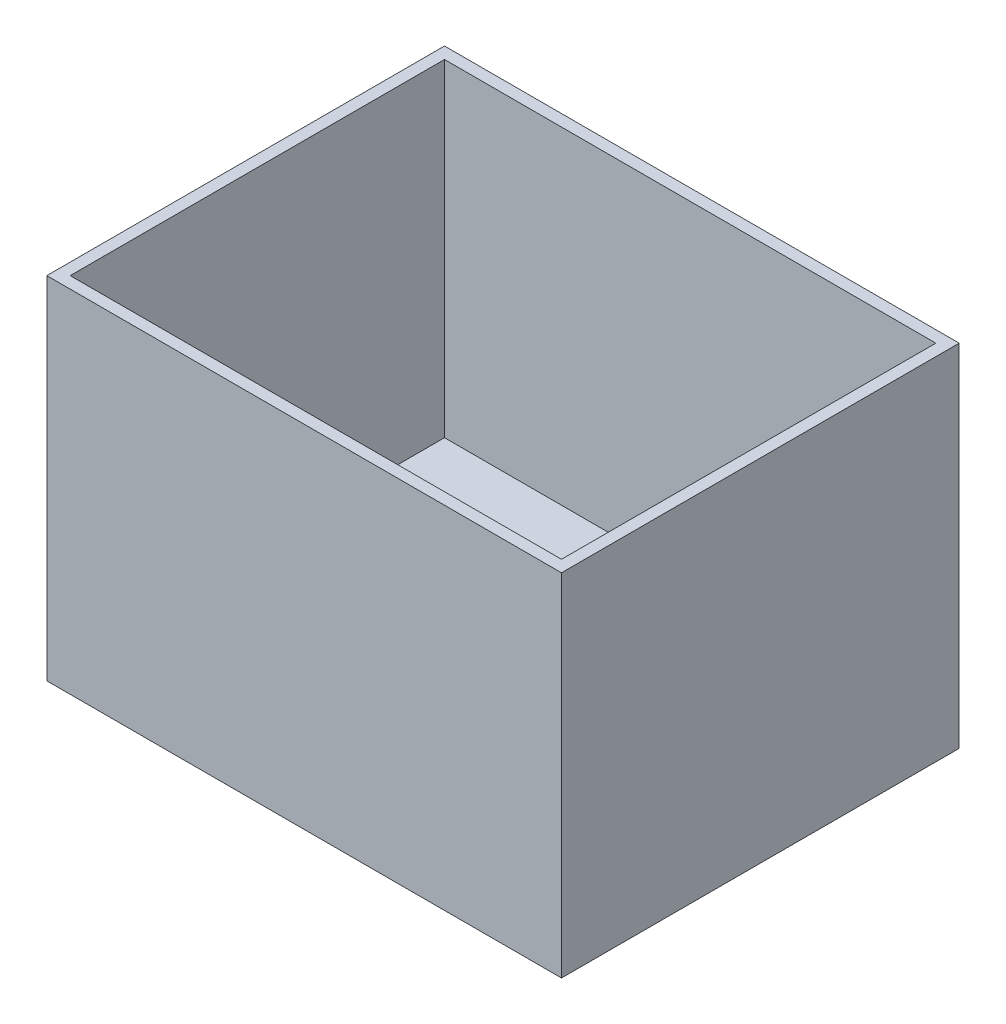
ISO-10303-21;
HEADER;
FILE_DESCRIPTION(('STEP AP214'),'2;1');
FILE_NAME('part.step','',(''),(''),'','','');
FILE_SCHEMA(('AUTOMOTIVE_DESIGN { 1 0 10303 214 1 1 1 1 }'));
ENDSEC;
DATA;
#1=APPLICATION_CONTEXT('core data for automotive mechanical design processes');
#2=APPLICATION_PROTOCOL_DEFINITION('international standard','automotive_design',2000,#1);
#3=PRODUCT_CONTEXT('',#1,'mechanical');
#4=PRODUCT('Part','Part','',(#3));
#5=PRODUCT_RELATED_PRODUCT_CATEGORY('part','',(#4));
#6=PRODUCT_DEFINITION_FORMATION('','',#4);
#7=PRODUCT_DEFINITION_CONTEXT('part definition',#1,'design');
#8=PRODUCT_DEFINITION('design','',#6,#7);
#9=PRODUCT_DEFINITION_SHAPE('','',#8);
#10=(LENGTH_UNIT() NAMED_UNIT(*) SI_UNIT(.MILLI.,.METRE.));
#11=(NAMED_UNIT(*) PLANE_ANGLE_UNIT() SI_UNIT($,.RADIAN.));
#12=(NAMED_UNIT(*) SI_UNIT($,.STERADIAN.) SOLID_ANGLE_UNIT());
#13=UNCERTAINTY_MEASURE_WITH_UNIT(LENGTH_MEASURE(1.E-05),#10,'distance_accuracy_value','');
#14=(GEOMETRIC_REPRESENTATION_CONTEXT(3) GLOBAL_UNCERTAINTY_ASSIGNED_CONTEXT((#13)) GLOBAL_UNIT_ASSIGNED_CONTEXT((#10,
#11,#12)) REPRESENTATION_CONTEXT('',''));
#15=CARTESIAN_POINT('',(0.,0.,0.));
#16=DIRECTION('',(0.,0.,1.));
#17=DIRECTION('',(1.,0.,0.));
#18=AXIS2_PLACEMENT_3D('',#15,#16,#17);
#19=CARTESIAN_POINT('',(220.,300.,170.));
#20=DIRECTION('',(-1.,0.,0.));
#21=DIRECTION('',(0.,0.,1.));
#22=AXIS2_PLACEMENT_3D('',#19,#20,#21);
#23=PLANE('',#22);
#24=DIRECTION('',(0.,0.,-1.));
#25=VECTOR('',#24,1.);
#26=CARTESIAN_POINT('',(220.,0.,170.));
#27=LINE('',#26,#25);
#28=CARTESIAN_POINT('',(220.,0.,170.));
#29=VERTEX_POINT('',#28);
#30=CARTESIAN_POINT('',(220.,0.,-170.));
#31=VERTEX_POINT('',#30);
#32=EDGE_CURVE('E164',#29,#31,#27,.T.);
#33=ORIENTED_EDGE('',*,*,#32,.T.);
#34=DIRECTION('',(0.,-1.,0.));
#35=VECTOR('',#34,1.);
#36=CARTESIAN_POINT('',(220.,300.,-170.));
#37=LINE('',#36,#35);
#38=CARTESIAN_POINT('',(220.,300.,-170.));
#39=VERTEX_POINT('',#38);
#40=EDGE_CURVE('E11',#39,#31,#37,.T.);
#41=ORIENTED_EDGE('',*,*,#40,.F.);
#42=DIRECTION('',(0.,0.,-1.));
#43=VECTOR('',#42,1.);
#44=CARTESIAN_POINT('',(220.,300.,170.));
#45=LINE('',#44,#43);
#46=CARTESIAN_POINT('',(220.,300.,170.));
#47=VERTEX_POINT('',#46);
#48=EDGE_CURVE('E170',#47,#39,#45,.T.);
#49=ORIENTED_EDGE('',*,*,#48,.F.);
#50=DIRECTION('',(0.,-1.,0.));
#51=VECTOR('',#50,1.);
#52=CARTESIAN_POINT('',(220.,300.,170.));
#53=LINE('',#52,#51);
#54=EDGE_CURVE('E180',#47,#29,#53,.T.);
#55=ORIENTED_EDGE('',*,*,#54,.T.);
#56=EDGE_LOOP('',(#33,#41,#49,#55));
#57=FACE_BOUND('',#56,.T.);
#58=ADVANCED_FACE('F45',(#57),#23,.F.);
#59=CARTESIAN_POINT('',(-220.,300.,-170.));
#60=DIRECTION('',(0.,0.,1.));
#61=DIRECTION('',(1.,0.,0.));
#62=AXIS2_PLACEMENT_3D('',#59,#60,#61);
#63=PLANE('',#62);
#64=DIRECTION('',(-1.,0.,0.));
#65=VECTOR('',#64,1.);
#66=CARTESIAN_POINT('',(-220.,0.,-170.));
#67=LINE('',#66,#65);
#68=CARTESIAN_POINT('',(-220.,0.,-170.));
#69=VERTEX_POINT('',#68);
#70=EDGE_CURVE('E184',#31,#69,#67,.T.);
#71=ORIENTED_EDGE('',*,*,#70,.T.);
#72=DIRECTION('',(0.,-1.,0.));
#73=VECTOR('',#72,1.);
#74=CARTESIAN_POINT('',(-220.,300.,-170.));
#75=LINE('',#74,#73);
#76=CARTESIAN_POINT('',(-220.,300.,-170.));
#77=VERTEX_POINT('',#76);
#78=EDGE_CURVE('E53',#77,#69,#75,.T.);
#79=ORIENTED_EDGE('',*,*,#78,.F.);
#80=DIRECTION('',(-1.,0.,0.));
#81=VECTOR('',#80,1.);
#82=CARTESIAN_POINT('',(-220.,300.,-170.));
#83=LINE('',#82,#81);
#84=EDGE_CURVE('E97',#39,#77,#83,.T.);
#85=ORIENTED_EDGE('',*,*,#84,.F.);
#86=ORIENTED_EDGE('',*,*,#40,.T.);
#87=EDGE_LOOP('',(#71,#79,#85,#86));
#88=FACE_BOUND('',#87,.T.);
#89=ADVANCED_FACE('F220',(#88),#63,.F.);
#90=CARTESIAN_POINT('',(-220.,300.,170.));
#91=DIRECTION('',(1.,0.,0.));
#92=DIRECTION('',(0.,0.,-1.));
#93=AXIS2_PLACEMENT_3D('',#90,#91,#92);
#94=PLANE('',#93);
#95=DIRECTION('',(0.,0.,1.));
#96=VECTOR('',#95,1.);
#97=CARTESIAN_POINT('',(-220.,0.,170.));
#98=LINE('',#97,#96);
#99=CARTESIAN_POINT('',(-220.,0.,170.));
#100=VERTEX_POINT('',#99);
#101=EDGE_CURVE('E187',#69,#100,#98,.T.);
#102=ORIENTED_EDGE('',*,*,#101,.T.);
#103=DIRECTION('',(0.,-1.,0.));
#104=VECTOR('',#103,1.);
#105=CARTESIAN_POINT('',(-220.,300.,170.));
#106=LINE('',#105,#104);
#107=CARTESIAN_POINT('',(-220.,300.,170.));
#108=VERTEX_POINT('',#107);
#109=EDGE_CURVE('E194',#108,#100,#106,.T.);
#110=ORIENTED_EDGE('',*,*,#109,.F.);
#111=DIRECTION('',(0.,0.,1.));
#112=VECTOR('',#111,1.);
#113=CARTESIAN_POINT('',(-220.,300.,170.));
#114=LINE('',#113,#112);
#115=EDGE_CURVE('E175',#77,#108,#114,.T.);
#116=ORIENTED_EDGE('',*,*,#115,.F.);
#117=ORIENTED_EDGE('',*,*,#78,.T.);
#118=EDGE_LOOP('',(#102,#110,#116,#117));
#119=FACE_BOUND('',#118,.T.);
#120=ADVANCED_FACE('F201',(#119),#94,.F.);
#121=CARTESIAN_POINT('',(-220.,300.,170.));
#122=DIRECTION('',(0.,0.,-1.));
#123=DIRECTION('',(-1.,0.,0.));
#124=AXIS2_PLACEMENT_3D('',#121,#122,#123);
#125=PLANE('',#124);
#126=DIRECTION('',(1.,0.,0.));
#127=VECTOR('',#126,1.);
#128=CARTESIAN_POINT('',(-220.,0.,170.));
#129=LINE('',#128,#127);
#130=EDGE_CURVE('E90',#100,#29,#129,.T.);
#131=ORIENTED_EDGE('',*,*,#130,.T.);
#132=ORIENTED_EDGE('',*,*,#54,.F.);
#133=DIRECTION('',(1.,0.,0.));
#134=VECTOR('',#133,1.);
#135=CARTESIAN_POINT('',(-220.,300.,170.));
#136=LINE('',#135,#134);
#137=EDGE_CURVE('E69',#108,#47,#136,.T.);
#138=ORIENTED_EDGE('',*,*,#137,.F.);
#139=ORIENTED_EDGE('',*,*,#109,.T.);
#140=EDGE_LOOP('',(#131,#132,#138,#139));
#141=FACE_BOUND('',#140,.T.);
#142=ADVANCED_FACE('F209',(#141),#125,.F.);
#143=CARTESIAN_POINT('',(0.,300.,0.));
#144=DIRECTION('',(0.,-1.,0.));
#145=DIRECTION('',(0.,0.,-1.));
#146=AXIS2_PLACEMENT_3D('',#143,#144,#145);
#147=PLANE('',#146);
#148=DIRECTION('',(-1.,0.,0.));
#149=VECTOR('',#148,1.);
#150=CARTESIAN_POINT('',(-210.,300.,-160.));
#151=LINE('',#150,#149);
#152=CARTESIAN_POINT('',(210.,300.,-160.));
#153=VERTEX_POINT('',#152);
#154=CARTESIAN_POINT('',(-210.,300.,-160.));
#155=VERTEX_POINT('',#154);
#156=EDGE_CURVE('E155',#153,#155,#151,.T.);
#157=ORIENTED_EDGE('',*,*,#156,.F.);
#158=DIRECTION('',(0.,0.,-1.));
#159=VECTOR('',#158,1.);
#160=CARTESIAN_POINT('',(210.,300.,160.));
#161=LINE('',#160,#159);
#162=CARTESIAN_POINT('',(210.,300.,160.));
#163=VERTEX_POINT('',#162);
#164=EDGE_CURVE('E60',#163,#153,#161,.T.);
#165=ORIENTED_EDGE('',*,*,#164,.F.);
#166=DIRECTION('',(1.,0.,0.));
#167=VECTOR('',#166,1.);
#168=CARTESIAN_POINT('',(-210.,300.,160.));
#169=LINE('',#168,#167);
#170=CARTESIAN_POINT('',(-210.,300.,160.));
#171=VERTEX_POINT('',#170);
#172=EDGE_CURVE('E142',#171,#163,#169,.T.);
#173=ORIENTED_EDGE('',*,*,#172,.F.);
#174=DIRECTION('',(0.,0.,1.));
#175=VECTOR('',#174,1.);
#176=CARTESIAN_POINT('',(-210.,300.,160.));
#177=LINE('',#176,#175);
#178=EDGE_CURVE('E146',#155,#171,#177,.T.);
#179=ORIENTED_EDGE('',*,*,#178,.F.);
#180=EDGE_LOOP('',(#157,#165,#173,#179));
#181=FACE_BOUND('',#180,.T.);
#182=ORIENTED_EDGE('',*,*,#48,.T.);
#183=ORIENTED_EDGE('',*,*,#84,.T.);
#184=ORIENTED_EDGE('',*,*,#115,.T.);
#185=ORIENTED_EDGE('',*,*,#137,.T.);
#186=EDGE_LOOP('',(#182,#183,#184,#185));
#187=FACE_BOUND('',#186,.T.);
#188=ADVANCED_FACE('F211',(#181,#187),#147,.F.);
#189=CARTESIAN_POINT('',(0.,0.,0.));
#190=DIRECTION('',(0.,-1.,0.));
#191=DIRECTION('',(0.,0.,-1.));
#192=AXIS2_PLACEMENT_3D('',#189,#190,#191);
#193=PLANE('',#192);
#194=ORIENTED_EDGE('',*,*,#32,.F.);
#195=ORIENTED_EDGE('',*,*,#130,.F.);
#196=ORIENTED_EDGE('',*,*,#101,.F.);
#197=ORIENTED_EDGE('',*,*,#70,.F.);
#198=EDGE_LOOP('',(#194,#195,#196,#197));
#199=FACE_BOUND('',#198,.T.);
#200=ADVANCED_FACE('F205',(#199),#193,.T.);
#201=CARTESIAN_POINT('',(210.,20.,160.));
#202=DIRECTION('',(1.,0.,0.));
#203=DIRECTION('',(0.,0.,-1.));
#204=AXIS2_PLACEMENT_3D('',#201,#202,#203);
#205=PLANE('',#204);
#206=ORIENTED_EDGE('',*,*,#164,.T.);
#207=DIRECTION('',(0.,1.,0.));
#208=VECTOR('',#207,1.);
#209=CARTESIAN_POINT('',(210.,20.,-160.));
#210=LINE('',#209,#208);
#211=CARTESIAN_POINT('',(210.,20.,-160.));
#212=VERTEX_POINT('',#211);
#213=EDGE_CURVE('E117',#212,#153,#210,.T.);
#214=ORIENTED_EDGE('',*,*,#213,.F.);
#215=DIRECTION('',(0.,0.,-1.));
#216=VECTOR('',#215,1.);
#217=CARTESIAN_POINT('',(210.,20.,160.));
#218=LINE('',#217,#216);
#219=CARTESIAN_POINT('',(210.,20.,160.));
#220=VERTEX_POINT('',#219);
#221=EDGE_CURVE('E121',#220,#212,#218,.T.);
#222=ORIENTED_EDGE('',*,*,#221,.F.);
#223=DIRECTION('',(0.,1.,0.));
#224=VECTOR('',#223,1.);
#225=CARTESIAN_POINT('',(210.,20.,160.));
#226=LINE('',#225,#224);
#227=EDGE_CURVE('E161',#220,#163,#226,.T.);
#228=ORIENTED_EDGE('',*,*,#227,.T.);
#229=EDGE_LOOP('',(#206,#214,#222,#228));
#230=FACE_BOUND('',#229,.T.);
#231=ADVANCED_FACE('F119',(#230),#205,.F.);
#232=CARTESIAN_POINT('',(-210.,20.,160.));
#233=DIRECTION('',(0.,0.,1.));
#234=DIRECTION('',(1.,0.,0.));
#235=AXIS2_PLACEMENT_3D('',#232,#233,#234);
#236=PLANE('',#235);
#237=ORIENTED_EDGE('',*,*,#172,.T.);
#238=ORIENTED_EDGE('',*,*,#227,.F.);
#239=DIRECTION('',(1.,0.,0.));
#240=VECTOR('',#239,1.);
#241=CARTESIAN_POINT('',(-210.,20.,160.));
#242=LINE('',#241,#240);
#243=CARTESIAN_POINT('',(-210.,20.,160.));
#244=VERTEX_POINT('',#243);
#245=EDGE_CURVE('E128',#244,#220,#242,.T.);
#246=ORIENTED_EDGE('',*,*,#245,.F.);
#247=DIRECTION('',(0.,1.,0.));
#248=VECTOR('',#247,1.);
#249=CARTESIAN_POINT('',(-210.,20.,160.));
#250=LINE('',#249,#248);
#251=EDGE_CURVE('E165',#244,#171,#250,.T.);
#252=ORIENTED_EDGE('',*,*,#251,.T.);
#253=EDGE_LOOP('',(#237,#238,#246,#252));
#254=FACE_BOUND('',#253,.T.);
#255=ADVANCED_FACE('F260',(#254),#236,.F.);
#256=CARTESIAN_POINT('',(-210.,20.,160.));
#257=DIRECTION('',(-1.,0.,0.));
#258=DIRECTION('',(0.,0.,1.));
#259=AXIS2_PLACEMENT_3D('',#256,#257,#258);
#260=PLANE('',#259);
#261=ORIENTED_EDGE('',*,*,#178,.T.);
#262=ORIENTED_EDGE('',*,*,#251,.F.);
#263=DIRECTION('',(0.,0.,1.));
#264=VECTOR('',#263,1.);
#265=CARTESIAN_POINT('',(-210.,20.,160.));
#266=LINE('',#265,#264);
#267=CARTESIAN_POINT('',(-210.,20.,-160.));
#268=VERTEX_POINT('',#267);
#269=EDGE_CURVE('E137',#268,#244,#266,.T.);
#270=ORIENTED_EDGE('',*,*,#269,.F.);
#271=DIRECTION('',(0.,1.,0.));
#272=VECTOR('',#271,1.);
#273=CARTESIAN_POINT('',(-210.,20.,-160.));
#274=LINE('',#273,#272);
#275=EDGE_CURVE('E127',#268,#155,#274,.T.);
#276=ORIENTED_EDGE('',*,*,#275,.T.);
#277=EDGE_LOOP('',(#261,#262,#270,#276));
#278=FACE_BOUND('',#277,.T.);
#279=ADVANCED_FACE('F269',(#278),#260,.F.);
#280=CARTESIAN_POINT('',(-210.,20.,-160.));
#281=DIRECTION('',(0.,0.,-1.));
#282=DIRECTION('',(-1.,0.,0.));
#283=AXIS2_PLACEMENT_3D('',#280,#281,#282);
#284=PLANE('',#283);
#285=ORIENTED_EDGE('',*,*,#156,.T.);
#286=ORIENTED_EDGE('',*,*,#275,.F.);
#287=DIRECTION('',(-1.,0.,0.));
#288=VECTOR('',#287,1.);
#289=CARTESIAN_POINT('',(-210.,20.,-160.));
#290=LINE('',#289,#288);
#291=EDGE_CURVE('E131',#212,#268,#290,.T.);
#292=ORIENTED_EDGE('',*,*,#291,.F.);
#293=ORIENTED_EDGE('',*,*,#213,.T.);
#294=EDGE_LOOP('',(#285,#286,#292,#293));
#295=FACE_BOUND('',#294,.T.);
#296=ADVANCED_FACE('F132',(#295),#284,.F.);
#297=CARTESIAN_POINT('',(0.,20.,0.));
#298=DIRECTION('',(0.,-1.,0.));
#299=DIRECTION('',(0.,0.,-1.));
#300=AXIS2_PLACEMENT_3D('',#297,#298,#299);
#301=PLANE('',#300);
#302=ORIENTED_EDGE('',*,*,#221,.T.);
#303=ORIENTED_EDGE('',*,*,#291,.T.);
#304=ORIENTED_EDGE('',*,*,#269,.T.);
#305=ORIENTED_EDGE('',*,*,#245,.T.);
#306=EDGE_LOOP('',(#302,#303,#304,#305));
#307=FACE_BOUND('',#306,.T.);
#308=ADVANCED_FACE('F139',(#307),#301,.F.);
#309=CLOSED_SHELL('',(#58,#89,#120,#142,#188,#200,#231,#255,#279,#296,#308));
#310=MANIFOLD_SOLID_BREP('B2',#309);
#311=ADVANCED_BREP_SHAPE_REPRESENTATION('',(#18,#310),#14);
#312=SHAPE_DEFINITION_REPRESENTATION(#9,#311);
ENDSEC;
END-ISO-10303-21;
